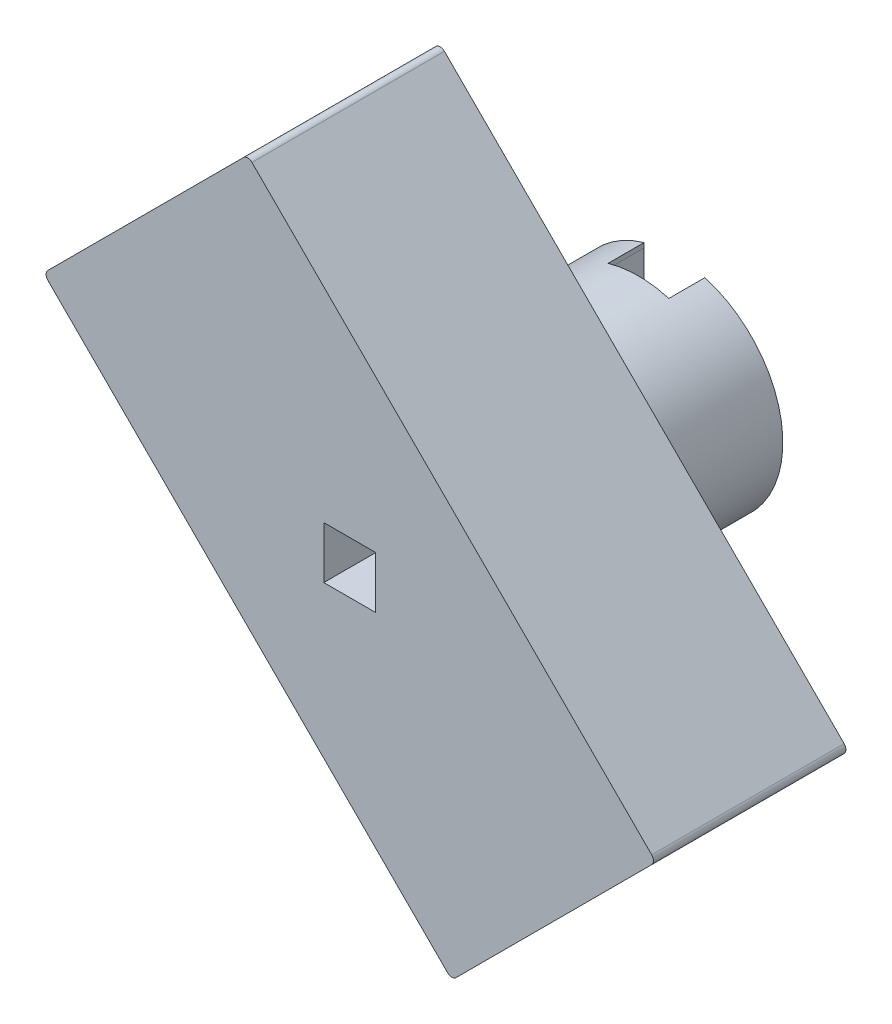
ISO-10303-21;
HEADER;
FILE_DESCRIPTION(('STEP AP214'),'2;1');
FILE_NAME('part.step','',(''),(''),'','','');
FILE_SCHEMA(('AUTOMOTIVE_DESIGN { 1 0 10303 214 1 1 1 1 }'));
ENDSEC;
DATA;
#1=APPLICATION_CONTEXT('core data for automotive mechanical design processes');
#2=APPLICATION_PROTOCOL_DEFINITION('international standard','automotive_design',2000,#1);
#3=PRODUCT_CONTEXT('',#1,'mechanical');
#4=PRODUCT('Part','Part','',(#3));
#5=PRODUCT_RELATED_PRODUCT_CATEGORY('part','',(#4));
#6=PRODUCT_DEFINITION_FORMATION('','',#4);
#7=PRODUCT_DEFINITION_CONTEXT('part definition',#1,'design');
#8=PRODUCT_DEFINITION('design','',#6,#7);
#9=PRODUCT_DEFINITION_SHAPE('','',#8);
#10=(LENGTH_UNIT() NAMED_UNIT(*) SI_UNIT(.MILLI.,.METRE.));
#11=(NAMED_UNIT(*) PLANE_ANGLE_UNIT() SI_UNIT($,.RADIAN.));
#12=(NAMED_UNIT(*) SI_UNIT($,.STERADIAN.) SOLID_ANGLE_UNIT());
#13=UNCERTAINTY_MEASURE_WITH_UNIT(LENGTH_MEASURE(1.E-05),#10,'distance_accuracy_value','');
#14=(GEOMETRIC_REPRESENTATION_CONTEXT(3) GLOBAL_UNCERTAINTY_ASSIGNED_CONTEXT((#13)) GLOBAL_UNIT_ASSIGNED_CONTEXT((#10,
#11,#12)) REPRESENTATION_CONTEXT('',''));
#15=CARTESIAN_POINT('',(0.,0.,0.));
#16=DIRECTION('',(0.,0.,1.));
#17=DIRECTION('',(1.,0.,0.));
#18=AXIS2_PLACEMENT_3D('',#15,#16,#17);
#19=CARTESIAN_POINT('',(0.,5.0927,17.7289));
#20=DIRECTION('',(0.,0.,1.));
#21=DIRECTION('',(1.,0.,0.));
#22=AXIS2_PLACEMENT_3D('',#19,#20,#21);
#23=PLANE('',#22);
#24=CARTESIAN_POINT('',(0.,5.0927,17.7289));
#25=DIRECTION('',(0.,0.,1.));
#26=DIRECTION('',(1.,0.,0.));
#27=AXIS2_PLACEMENT_3D('',#24,#25,#26);
#28=CIRCLE('',#27,7.14375);
#29=CARTESIAN_POINT('',(-2.00523079058413,11.9492453064202,17.7289));
#30=VERTEX_POINT('',#29);
#31=CARTESIAN_POINT('',(-2.00523079058413,-1.76384530642024,17.7289));
#32=VERTEX_POINT('',#31);
#33=EDGE_CURVE('E276',#30,#32,#28,.T.);
#34=ORIENTED_EDGE('',*,*,#33,.F.);
#35=CARTESIAN_POINT('',(0.,11.6205,17.7289));
#36=DIRECTION('',(0.,0.,1.));
#37=DIRECTION('',(1.,0.,0.));
#38=AXIS2_PLACEMENT_3D('',#35,#36,#37);
#39=CIRCLE('',#38,2.032);
#40=CARTESIAN_POINT('',(-2.032,11.6205,17.7289));
#41=VERTEX_POINT('',#40);
#42=EDGE_CURVE('E339',#30,#41,#39,.T.);
#43=ORIENTED_EDGE('',*,*,#42,.T.);
#44=DIRECTION('',(0.,-1.,0.));
#45=VECTOR('',#44,1.);
#46=CARTESIAN_POINT('',(-2.032,11.6205,17.7289));
#47=LINE('',#46,#45);
#48=CARTESIAN_POINT('',(-2.032,8.09704768294217,17.7289));
#49=VERTEX_POINT('',#48);
#50=EDGE_CURVE('E344',#41,#49,#47,.T.);
#51=ORIENTED_EDGE('',*,*,#50,.T.);
#52=CARTESIAN_POINT('',(0.,5.0927,17.7289));
#53=DIRECTION('',(0.,0.,1.));
#54=DIRECTION('',(1.,0.,0.));
#55=AXIS2_PLACEMENT_3D('',#52,#53,#54);
#56=CIRCLE('',#55,3.627);
#57=CARTESIAN_POINT('',(-2.032,2.08835231705783,17.7289));
#58=VERTEX_POINT('',#57);
#59=EDGE_CURVE('E313',#49,#58,#56,.T.);
#60=ORIENTED_EDGE('',*,*,#59,.T.);
#61=DIRECTION('',(0.,-1.,0.));
#62=VECTOR('',#61,1.);
#63=CARTESIAN_POINT('',(-2.032,2.08835231705783,17.7289));
#64=LINE('',#63,#62);
#65=CARTESIAN_POINT('',(-2.032,-1.4351,17.7289));
#66=VERTEX_POINT('',#65);
#67=EDGE_CURVE('E317',#58,#66,#64,.T.);
#68=ORIENTED_EDGE('',*,*,#67,.T.);
#69=CARTESIAN_POINT('',(0.,-1.4351,17.7289));
#70=DIRECTION('',(0.,0.,1.));
#71=DIRECTION('',(1.,0.,0.));
#72=AXIS2_PLACEMENT_3D('',#69,#70,#71);
#73=CIRCLE('',#72,2.032);
#74=EDGE_CURVE('E323',#66,#32,#73,.T.);
#75=ORIENTED_EDGE('',*,*,#74,.T.);
#76=EDGE_LOOP('',(#34,#43,#51,#60,#68,#75));
#77=FACE_BOUND('',#76,.T.);
#78=ADVANCED_FACE('F39',(#77),#23,.F.);
#79=CARTESIAN_POINT('',(2.00523079058413,-1.76384530642024,17.7289));
#80=VERTEX_POINT('',#79);
#81=CARTESIAN_POINT('',(2.00523079058413,11.9492453064202,17.7289));
#82=VERTEX_POINT('',#81);
#83=EDGE_CURVE('E273',#80,#82,#28,.T.);
#84=ORIENTED_EDGE('',*,*,#83,.F.);
#85=CARTESIAN_POINT('',(2.032,-1.4351,17.7289));
#86=VERTEX_POINT('',#85);
#87=EDGE_CURVE('E322',#80,#86,#73,.T.);
#88=ORIENTED_EDGE('',*,*,#87,.T.);
#89=DIRECTION('',(0.,1.,0.));
#90=VECTOR('',#89,1.);
#91=CARTESIAN_POINT('',(2.032,-1.4351,17.7289));
#92=LINE('',#91,#90);
#93=CARTESIAN_POINT('',(2.032,2.08835231705782,17.7289));
#94=VERTEX_POINT('',#93);
#95=EDGE_CURVE('E327',#86,#94,#92,.T.);
#96=ORIENTED_EDGE('',*,*,#95,.T.);
#97=CARTESIAN_POINT('',(0.,5.0927,17.7289));
#98=DIRECTION('',(0.,0.,1.));
#99=DIRECTION('',(1.,0.,0.));
#100=AXIS2_PLACEMENT_3D('',#97,#98,#99);
#101=CIRCLE('',#100,3.627);
#102=CARTESIAN_POINT('',(2.032,8.09704768294217,17.7289));
#103=VERTEX_POINT('',#102);
#104=EDGE_CURVE('E331',#94,#103,#101,.T.);
#105=ORIENTED_EDGE('',*,*,#104,.T.);
#106=DIRECTION('',(0.,1.,0.));
#107=VECTOR('',#106,1.);
#108=CARTESIAN_POINT('',(2.032,8.09704768294217,17.7289));
#109=LINE('',#108,#107);
#110=CARTESIAN_POINT('',(2.032,11.6205,17.7289));
#111=VERTEX_POINT('',#110);
#112=EDGE_CURVE('E335',#103,#111,#109,.T.);
#113=ORIENTED_EDGE('',*,*,#112,.T.);
#114=EDGE_CURVE('E340',#111,#82,#39,.T.);
#115=ORIENTED_EDGE('',*,*,#114,.T.);
#116=EDGE_LOOP('',(#84,#88,#96,#105,#113,#115));
#117=FACE_BOUND('',#116,.T.);
#118=ADVANCED_FACE('F509',(#117),#23,.F.);
#119=CARTESIAN_POINT('',(0.,11.6205,17.7289));
#120=DIRECTION('',(0.,0.,1.));
#121=DIRECTION('',(1.,0.,0.));
#122=AXIS2_PLACEMENT_3D('',#119,#120,#121);
#123=CYLINDRICAL_SURFACE('',#122,2.032);
#124=DIRECTION('',(0.,0.,-1.));
#125=VECTOR('',#124,1.);
#126=CARTESIAN_POINT('',(2.00523079058413,11.9492453064202,22.094519));
#127=LINE('',#126,#125);
#128=CARTESIAN_POINT('',(2.00523079058413,11.9492453064202,20.11015));
#129=VERTEX_POINT('',#128);
#130=EDGE_CURVE('E280',#82,#129,#127,.F.);
#131=ORIENTED_EDGE('',*,*,#130,.F.);
#132=ORIENTED_EDGE('',*,*,#114,.F.);
#133=DIRECTION('',(0.,0.,1.));
#134=VECTOR('',#133,1.);
#135=CARTESIAN_POINT('',(2.032,11.6205,17.7289));
#136=LINE('',#135,#134);
#137=CARTESIAN_POINT('',(2.032,11.6205,20.11015));
#138=VERTEX_POINT('',#137);
#139=EDGE_CURVE('E390',#111,#138,#136,.T.);
#140=ORIENTED_EDGE('',*,*,#139,.T.);
#141=CARTESIAN_POINT('',(0.,11.6205,20.11015));
#142=DIRECTION('',(0.,0.,1.));
#143=DIRECTION('',(1.,0.,0.));
#144=AXIS2_PLACEMENT_3D('',#141,#142,#143);
#145=CIRCLE('',#144,2.032);
#146=EDGE_CURVE('E374',#138,#129,#145,.T.);
#147=ORIENTED_EDGE('',*,*,#146,.T.);
#148=EDGE_LOOP('',(#131,#132,#140,#147));
#149=FACE_BOUND('',#148,.T.);
#150=ADVANCED_FACE('F515',(#149),#123,.F.);
#151=DIRECTION('',(0.,0.,-1.));
#152=VECTOR('',#151,1.);
#153=CARTESIAN_POINT('',(-2.00523079058413,11.9492453064202,22.094519));
#154=LINE('',#153,#152);
#155=CARTESIAN_POINT('',(-2.00523079058413,11.9492453064202,20.11015));
#156=VERTEX_POINT('',#155);
#157=EDGE_CURVE('E277',#156,#30,#154,.T.);
#158=ORIENTED_EDGE('',*,*,#157,.F.);
#159=CARTESIAN_POINT('',(-2.032,11.6205,20.11015));
#160=VERTEX_POINT('',#159);
#161=EDGE_CURVE('E373',#156,#160,#145,.T.);
#162=ORIENTED_EDGE('',*,*,#161,.T.);
#163=DIRECTION('',(0.,0.,1.));
#164=VECTOR('',#163,1.);
#165=CARTESIAN_POINT('',(-2.032,11.6205,17.7289));
#166=LINE('',#165,#164);
#167=EDGE_CURVE('E386',#41,#160,#166,.T.);
#168=ORIENTED_EDGE('',*,*,#167,.F.);
#169=ORIENTED_EDGE('',*,*,#42,.F.);
#170=EDGE_LOOP('',(#158,#162,#168,#169));
#171=FACE_BOUND('',#170,.T.);
#172=ADVANCED_FACE('F575',(#171),#123,.F.);
#173=CARTESIAN_POINT('',(0.,-1.4351,17.7289));
#174=DIRECTION('',(0.,0.,1.));
#175=DIRECTION('',(1.,0.,0.));
#176=AXIS2_PLACEMENT_3D('',#173,#174,#175);
#177=CYLINDRICAL_SURFACE('',#176,2.032);
#178=DIRECTION('',(0.,0.,-1.));
#179=VECTOR('',#178,1.);
#180=CARTESIAN_POINT('',(-2.00523079058413,-1.76384530642024,22.094519));
#181=LINE('',#180,#179);
#182=CARTESIAN_POINT('',(-2.00523079058413,-1.76384530642024,20.11015));
#183=VERTEX_POINT('',#182);
#184=EDGE_CURVE('E270',#32,#183,#181,.F.);
#185=ORIENTED_EDGE('',*,*,#184,.F.);
#186=ORIENTED_EDGE('',*,*,#74,.F.);
#187=DIRECTION('',(0.,0.,1.));
#188=VECTOR('',#187,1.);
#189=CARTESIAN_POINT('',(-2.032,-1.4351,17.7289));
#190=LINE('',#189,#188);
#191=CARTESIAN_POINT('',(-2.032,-1.4351,20.11015));
#192=VERTEX_POINT('',#191);
#193=EDGE_CURVE('E406',#66,#192,#190,.T.);
#194=ORIENTED_EDGE('',*,*,#193,.T.);
#195=CARTESIAN_POINT('',(0.,-1.4351,20.11015));
#196=DIRECTION('',(0.,0.,1.));
#197=DIRECTION('',(1.,0.,0.));
#198=AXIS2_PLACEMENT_3D('',#195,#196,#197);
#199=CIRCLE('',#198,2.032);
#200=EDGE_CURVE('E357',#192,#183,#199,.T.);
#201=ORIENTED_EDGE('',*,*,#200,.T.);
#202=EDGE_LOOP('',(#185,#186,#194,#201));
#203=FACE_BOUND('',#202,.T.);
#204=ADVANCED_FACE('F588',(#203),#177,.F.);
#205=DIRECTION('',(0.,0.,-1.));
#206=VECTOR('',#205,1.);
#207=CARTESIAN_POINT('',(2.00523079058413,-1.76384530642024,22.094519));
#208=LINE('',#207,#206);
#209=CARTESIAN_POINT('',(2.00523079058413,-1.76384530642024,20.11015));
#210=VERTEX_POINT('',#209);
#211=EDGE_CURVE('E254',#210,#80,#208,.T.);
#212=ORIENTED_EDGE('',*,*,#211,.F.);
#213=CARTESIAN_POINT('',(2.032,-1.4351,20.11015));
#214=VERTEX_POINT('',#213);
#215=EDGE_CURVE('E356',#210,#214,#199,.T.);
#216=ORIENTED_EDGE('',*,*,#215,.T.);
#217=DIRECTION('',(0.,0.,1.));
#218=VECTOR('',#217,1.);
#219=CARTESIAN_POINT('',(2.032,-1.4351,17.7289));
#220=LINE('',#219,#218);
#221=EDGE_CURVE('E402',#86,#214,#220,.T.);
#222=ORIENTED_EDGE('',*,*,#221,.F.);
#223=ORIENTED_EDGE('',*,*,#87,.F.);
#224=EDGE_LOOP('',(#212,#216,#222,#223));
#225=FACE_BOUND('',#224,.T.);
#226=ADVANCED_FACE('F566',(#225),#177,.F.);
#227=CARTESIAN_POINT('',(0.,5.0927,20.11015));
#228=DIRECTION('',(0.,0.,1.));
#229=DIRECTION('',(1.,0.,0.));
#230=AXIS2_PLACEMENT_3D('',#227,#228,#229);
#231=PLANE('',#230);
#232=CARTESIAN_POINT('',(0.,5.0927,20.11015));
#233=DIRECTION('',(0.,0.,-1.));
#234=DIRECTION('',(-1.,0.,0.));
#235=AXIS2_PLACEMENT_3D('',#232,#233,#234);
#236=CIRCLE('',#235,1.25);
#237=CARTESIAN_POINT('',(-1.25,5.0927,20.11015));
#238=VERTEX_POINT('',#237);
#239=EDGE_CURVE('E283',#238,#238,#236,.T.);
#240=ORIENTED_EDGE('',*,*,#239,.F.);
#241=EDGE_LOOP('',(#240));
#242=FACE_BOUND('',#241,.T.);
#243=CARTESIAN_POINT('',(0.,5.0927,20.11015));
#244=DIRECTION('',(0.,0.,1.));
#245=DIRECTION('',(1.,0.,0.));
#246=AXIS2_PLACEMENT_3D('',#243,#244,#245);
#247=CIRCLE('',#246,7.14375);
#248=EDGE_CURVE('E415',#129,#156,#247,.T.);
#249=ORIENTED_EDGE('',*,*,#248,.F.);
#250=ORIENTED_EDGE('',*,*,#146,.F.);
#251=DIRECTION('',(0.,1.,0.));
#252=VECTOR('',#251,1.);
#253=CARTESIAN_POINT('',(2.032,8.09704768294217,20.11015));
#254=LINE('',#253,#252);
#255=CARTESIAN_POINT('',(2.032,8.09704768294217,20.11015));
#256=VERTEX_POINT('',#255);
#257=EDGE_CURVE('E369',#256,#138,#254,.T.);
#258=ORIENTED_EDGE('',*,*,#257,.F.);
#259=CARTESIAN_POINT('',(0.,5.0927,20.11015));
#260=DIRECTION('',(0.,0.,1.));
#261=DIRECTION('',(1.,0.,0.));
#262=AXIS2_PLACEMENT_3D('',#259,#260,#261);
#263=CIRCLE('',#262,3.627);
#264=CARTESIAN_POINT('',(2.032,2.08835231705782,20.11015));
#265=VERTEX_POINT('',#264);
#266=EDGE_CURVE('E365',#265,#256,#263,.T.);
#267=ORIENTED_EDGE('',*,*,#266,.F.);
#268=DIRECTION('',(0.,1.,0.));
#269=VECTOR('',#268,1.);
#270=CARTESIAN_POINT('',(2.032,-1.4351,20.11015));
#271=LINE('',#270,#269);
#272=EDGE_CURVE('E361',#214,#265,#271,.T.);
#273=ORIENTED_EDGE('',*,*,#272,.F.);
#274=ORIENTED_EDGE('',*,*,#215,.F.);
#275=EDGE_CURVE('E385',#183,#210,#247,.T.);
#276=ORIENTED_EDGE('',*,*,#275,.F.);
#277=ORIENTED_EDGE('',*,*,#200,.F.);
#278=DIRECTION('',(0.,-1.,0.));
#279=VECTOR('',#278,1.);
#280=CARTESIAN_POINT('',(-2.032,2.08835231705783,20.11015));
#281=LINE('',#280,#279);
#282=CARTESIAN_POINT('',(-2.032,2.08835231705783,20.11015));
#283=VERTEX_POINT('',#282);
#284=EDGE_CURVE('E352',#283,#192,#281,.T.);
#285=ORIENTED_EDGE('',*,*,#284,.F.);
#286=CARTESIAN_POINT('',(0.,5.0927,20.11015));
#287=DIRECTION('',(0.,0.,1.));
#288=DIRECTION('',(1.,0.,0.));
#289=AXIS2_PLACEMENT_3D('',#286,#287,#288);
#290=CIRCLE('',#289,3.627);
#291=CARTESIAN_POINT('',(-2.032,8.09704768294217,20.11015));
#292=VERTEX_POINT('',#291);
#293=EDGE_CURVE('E312',#292,#283,#290,.T.);
#294=ORIENTED_EDGE('',*,*,#293,.F.);
#295=DIRECTION('',(0.,-1.,0.));
#296=VECTOR('',#295,1.);
#297=CARTESIAN_POINT('',(-2.032,11.6205,20.11015));
#298=LINE('',#297,#296);
#299=EDGE_CURVE('E318',#160,#292,#298,.T.);
#300=ORIENTED_EDGE('',*,*,#299,.F.);
#301=ORIENTED_EDGE('',*,*,#161,.F.);
#302=EDGE_LOOP('',(#249,#250,#258,#267,#273,#274,#276,#277,#285,#294,#300,#301));
#303=FACE_BOUND('',#302,.T.);
#304=ADVANCED_FACE('F562',(#242,#303),#231,.F.);
#305=CARTESIAN_POINT('',(-1.7145,3.3782,26.46015));
#306=DIRECTION('',(0.,1.,0.));
#307=DIRECTION('',(0.,0.,1.));
#308=AXIS2_PLACEMENT_3D('',#305,#306,#307);
#309=PLANE('',#308);
#310=DIRECTION('',(0.,0.,-1.));
#311=VECTOR('',#310,1.);
#312=CARTESIAN_POINT('',(1.7145,3.3782,26.46015));
#313=LINE('',#312,#311);
#314=CARTESIAN_POINT('',(1.7145,3.3782,39.16015));
#315=VERTEX_POINT('',#314);
#316=CARTESIAN_POINT('',(1.7145,3.3782,21.11015));
#317=VERTEX_POINT('',#316);
#318=EDGE_CURVE('E308',#315,#317,#313,.T.);
#319=ORIENTED_EDGE('',*,*,#318,.T.);
#320=DIRECTION('',(-1.,0.,0.));
#321=VECTOR('',#320,1.);
#322=CARTESIAN_POINT('',(1.7145,3.3782,21.11015));
#323=LINE('',#322,#321);
#324=CARTESIAN_POINT('',(-1.7145,3.3782,21.11015));
#325=VERTEX_POINT('',#324);
#326=EDGE_CURVE('E300',#317,#325,#323,.T.);
#327=ORIENTED_EDGE('',*,*,#326,.T.);
#328=DIRECTION('',(0.,0.,-1.));
#329=VECTOR('',#328,1.);
#330=CARTESIAN_POINT('',(-1.7145,3.3782,26.46015));
#331=LINE('',#330,#329);
#332=CARTESIAN_POINT('',(-1.7145,3.3782,39.16015));
#333=VERTEX_POINT('',#332);
#334=EDGE_CURVE('E216',#333,#325,#331,.T.);
#335=ORIENTED_EDGE('',*,*,#334,.F.);
#336=DIRECTION('',(1.,0.,0.));
#337=VECTOR('',#336,1.);
#338=CARTESIAN_POINT('',(-1.7145,3.3782,39.16015));
#339=LINE('',#338,#337);
#340=EDGE_CURVE('E229',#333,#315,#339,.T.);
#341=ORIENTED_EDGE('',*,*,#340,.T.);
#342=EDGE_LOOP('',(#319,#327,#335,#341));
#343=FACE_BOUND('',#342,.T.);
#344=ADVANCED_FACE('F558',(#343),#309,.T.);
#345=CARTESIAN_POINT('',(1.7145,3.3782,26.46015));
#346=DIRECTION('',(-1.,0.,0.));
#347=DIRECTION('',(0.,0.,1.));
#348=AXIS2_PLACEMENT_3D('',#345,#346,#347);
#349=PLANE('',#348);
#350=DIRECTION('',(0.,0.,-1.));
#351=VECTOR('',#350,1.);
#352=CARTESIAN_POINT('',(1.7145,6.8072,26.46015));
#353=LINE('',#352,#351);
#354=CARTESIAN_POINT('',(1.7145,6.8072,39.16015));
#355=VERTEX_POINT('',#354);
#356=CARTESIAN_POINT('',(1.7145,6.8072,21.11015));
#357=VERTEX_POINT('',#356);
#358=EDGE_CURVE('E215',#355,#357,#353,.T.);
#359=ORIENTED_EDGE('',*,*,#358,.T.);
#360=DIRECTION('',(0.,-1.,0.));
#361=VECTOR('',#360,1.);
#362=CARTESIAN_POINT('',(1.7145,6.8072,21.11015));
#363=LINE('',#362,#361);
#364=EDGE_CURVE('E296',#357,#317,#363,.T.);
#365=ORIENTED_EDGE('',*,*,#364,.T.);
#366=ORIENTED_EDGE('',*,*,#318,.F.);
#367=DIRECTION('',(0.,1.,0.));
#368=VECTOR('',#367,1.);
#369=CARTESIAN_POINT('',(1.7145,3.3782,39.16015));
#370=LINE('',#369,#368);
#371=EDGE_CURVE('E233',#315,#355,#370,.T.);
#372=ORIENTED_EDGE('',*,*,#371,.T.);
#373=EDGE_LOOP('',(#359,#365,#366,#372));
#374=FACE_BOUND('',#373,.T.);
#375=ADVANCED_FACE('F555',(#374),#349,.T.);
#376=CARTESIAN_POINT('',(1.7145,6.8072,26.46015));
#377=DIRECTION('',(0.,-1.,0.));
#378=DIRECTION('',(0.,0.,-1.));
#379=AXIS2_PLACEMENT_3D('',#376,#377,#378);
#380=PLANE('',#379);
#381=DIRECTION('',(0.,0.,-1.));
#382=VECTOR('',#381,1.);
#383=CARTESIAN_POINT('',(-1.7145,6.8072,26.46015));
#384=LINE('',#383,#382);
#385=CARTESIAN_POINT('',(-1.7145,6.8072,39.16015));
#386=VERTEX_POINT('',#385);
#387=CARTESIAN_POINT('',(-1.7145,6.8072,21.11015));
#388=VERTEX_POINT('',#387);
#389=EDGE_CURVE('E204',#386,#388,#384,.T.);
#390=ORIENTED_EDGE('',*,*,#389,.T.);
#391=DIRECTION('',(1.,0.,0.));
#392=VECTOR('',#391,1.);
#393=CARTESIAN_POINT('',(-1.7145,6.8072,21.11015));
#394=LINE('',#393,#392);
#395=EDGE_CURVE('E293',#388,#357,#394,.T.);
#396=ORIENTED_EDGE('',*,*,#395,.T.);
#397=ORIENTED_EDGE('',*,*,#358,.F.);
#398=DIRECTION('',(-1.,0.,0.));
#399=VECTOR('',#398,1.);
#400=CARTESIAN_POINT('',(1.7145,6.8072,39.16015));
#401=LINE('',#400,#399);
#402=EDGE_CURVE('E219',#355,#386,#401,.T.);
#403=ORIENTED_EDGE('',*,*,#402,.T.);
#404=EDGE_LOOP('',(#390,#396,#397,#403));
#405=FACE_BOUND('',#404,.T.);
#406=ADVANCED_FACE('F220',(#405),#380,.T.);
#407=CARTESIAN_POINT('',(-1.7145,6.8072,26.46015));
#408=DIRECTION('',(1.,0.,0.));
#409=DIRECTION('',(0.,0.,-1.));
#410=AXIS2_PLACEMENT_3D('',#407,#408,#409);
#411=PLANE('',#410);
#412=ORIENTED_EDGE('',*,*,#334,.T.);
#413=DIRECTION('',(0.,1.,0.));
#414=VECTOR('',#413,1.);
#415=CARTESIAN_POINT('',(-1.7145,3.3782,21.11015));
#416=LINE('',#415,#414);
#417=EDGE_CURVE('E211',#325,#388,#416,.T.);
#418=ORIENTED_EDGE('',*,*,#417,.T.);
#419=ORIENTED_EDGE('',*,*,#389,.F.);
#420=DIRECTION('',(0.,-1.,0.));
#421=VECTOR('',#420,1.);
#422=CARTESIAN_POINT('',(-1.7145,6.8072,39.16015));
#423=LINE('',#422,#421);
#424=EDGE_CURVE('E209',#386,#333,#423,.T.);
#425=ORIENTED_EDGE('',*,*,#424,.T.);
#426=EDGE_LOOP('',(#412,#418,#419,#425));
#427=FACE_BOUND('',#426,.T.);
#428=ADVANCED_FACE('F207',(#427),#411,.T.);
#429=CARTESIAN_POINT('',(0.,5.0927,17.7289));
#430=DIRECTION('',(0.,0.,1.));
#431=DIRECTION('',(1.,0.,0.));
#432=AXIS2_PLACEMENT_3D('',#429,#430,#431);
#433=CYLINDRICAL_SURFACE('',#432,3.627);
#434=ORIENTED_EDGE('',*,*,#293,.T.);
#435=DIRECTION('',(0.,0.,1.));
#436=VECTOR('',#435,1.);
#437=CARTESIAN_POINT('',(-2.032,2.08835231705783,17.7289));
#438=LINE('',#437,#436);
#439=EDGE_CURVE('E348',#58,#283,#438,.T.);
#440=ORIENTED_EDGE('',*,*,#439,.F.);
#441=ORIENTED_EDGE('',*,*,#59,.F.);
#442=DIRECTION('',(0.,0.,1.));
#443=VECTOR('',#442,1.);
#444=CARTESIAN_POINT('',(-2.032,8.09704768294217,17.7289));
#445=LINE('',#444,#443);
#446=EDGE_CURVE('E381',#49,#292,#445,.T.);
#447=ORIENTED_EDGE('',*,*,#446,.T.);
#448=EDGE_LOOP('',(#434,#440,#441,#447));
#449=FACE_BOUND('',#448,.T.);
#450=ADVANCED_FACE('F520',(#449),#433,.F.);
#451=CARTESIAN_POINT('',(-2.032,11.6205,17.7289));
#452=DIRECTION('',(-1.,0.,0.));
#453=DIRECTION('',(0.,0.,1.));
#454=AXIS2_PLACEMENT_3D('',#451,#452,#453);
#455=PLANE('',#454);
#456=ORIENTED_EDGE('',*,*,#299,.T.);
#457=ORIENTED_EDGE('',*,*,#446,.F.);
#458=ORIENTED_EDGE('',*,*,#50,.F.);
#459=ORIENTED_EDGE('',*,*,#167,.T.);
#460=EDGE_LOOP('',(#456,#457,#458,#459));
#461=FACE_BOUND('',#460,.T.);
#462=ADVANCED_FACE('F568',(#461),#455,.F.);
#463=CARTESIAN_POINT('',(2.032,8.09704768294217,17.7289));
#464=DIRECTION('',(1.,0.,0.));
#465=DIRECTION('',(0.,1.,0.));
#466=AXIS2_PLACEMENT_3D('',#463,#464,#465);
#467=PLANE('',#466);
#468=ORIENTED_EDGE('',*,*,#257,.T.);
#469=ORIENTED_EDGE('',*,*,#139,.F.);
#470=ORIENTED_EDGE('',*,*,#112,.F.);
#471=DIRECTION('',(0.,0.,1.));
#472=VECTOR('',#471,1.);
#473=CARTESIAN_POINT('',(2.032,8.09704768294217,17.7289));
#474=LINE('',#473,#472);
#475=EDGE_CURVE('E394',#103,#256,#474,.T.);
#476=ORIENTED_EDGE('',*,*,#475,.T.);
#477=EDGE_LOOP('',(#468,#469,#470,#476));
#478=FACE_BOUND('',#477,.T.);
#479=ADVANCED_FACE('F571',(#478),#467,.F.);
#480=CARTESIAN_POINT('',(0.,5.0927,17.7289));
#481=DIRECTION('',(0.,0.,1.));
#482=DIRECTION('',(1.,0.,0.));
#483=AXIS2_PLACEMENT_3D('',#480,#481,#482);
#484=CYLINDRICAL_SURFACE('',#483,3.627);
#485=ORIENTED_EDGE('',*,*,#266,.T.);
#486=ORIENTED_EDGE('',*,*,#475,.F.);
#487=ORIENTED_EDGE('',*,*,#104,.F.);
#488=DIRECTION('',(0.,0.,1.));
#489=VECTOR('',#488,1.);
#490=CARTESIAN_POINT('',(2.032,2.08835231705782,17.7289));
#491=LINE('',#490,#489);
#492=EDGE_CURVE('E398',#94,#265,#491,.T.);
#493=ORIENTED_EDGE('',*,*,#492,.T.);
#494=EDGE_LOOP('',(#485,#486,#487,#493));
#495=FACE_BOUND('',#494,.T.);
#496=ADVANCED_FACE('F579',(#495),#484,.F.);
#497=CARTESIAN_POINT('',(2.032,-1.4351,17.7289));
#498=DIRECTION('',(1.,0.,0.));
#499=DIRECTION('',(0.,1.,0.));
#500=AXIS2_PLACEMENT_3D('',#497,#498,#499);
#501=PLANE('',#500);
#502=ORIENTED_EDGE('',*,*,#272,.T.);
#503=ORIENTED_EDGE('',*,*,#492,.F.);
#504=ORIENTED_EDGE('',*,*,#95,.F.);
#505=ORIENTED_EDGE('',*,*,#221,.T.);
#506=EDGE_LOOP('',(#502,#503,#504,#505));
#507=FACE_BOUND('',#506,.T.);
#508=ADVANCED_FACE('F583',(#507),#501,.F.);
#509=CARTESIAN_POINT('',(-2.032,2.08835231705783,17.7289));
#510=DIRECTION('',(-1.,0.,0.));
#511=DIRECTION('',(0.,-1.,0.));
#512=AXIS2_PLACEMENT_3D('',#509,#510,#511);
#513=PLANE('',#512);
#514=ORIENTED_EDGE('',*,*,#284,.T.);
#515=ORIENTED_EDGE('',*,*,#193,.F.);
#516=ORIENTED_EDGE('',*,*,#67,.F.);
#517=ORIENTED_EDGE('',*,*,#439,.T.);
#518=EDGE_LOOP('',(#514,#515,#516,#517));
#519=FACE_BOUND('',#518,.T.);
#520=ADVANCED_FACE('F549',(#519),#513,.F.);
#521=CARTESIAN_POINT('',(0.,0.,21.11015));
#522=DIRECTION('',(0.,0.,-1.));
#523=DIRECTION('',(-1.,0.,0.));
#524=AXIS2_PLACEMENT_3D('',#521,#522,#523);
#525=PLANE('',#524);
#526=CARTESIAN_POINT('',(0.,5.0927,21.11015));
#527=DIRECTION('',(0.,0.,-1.));
#528=DIRECTION('',(-1.,0.,0.));
#529=AXIS2_PLACEMENT_3D('',#526,#527,#528);
#530=CIRCLE('',#529,1.25);
#531=CARTESIAN_POINT('',(-1.25,5.0927,21.11015));
#532=VERTEX_POINT('',#531);
#533=EDGE_CURVE('E284',#532,#532,#530,.T.);
#534=ORIENTED_EDGE('',*,*,#533,.T.);
#535=EDGE_LOOP('',(#534));
#536=FACE_BOUND('',#535,.T.);
#537=ORIENTED_EDGE('',*,*,#417,.F.);
#538=ORIENTED_EDGE('',*,*,#326,.F.);
#539=ORIENTED_EDGE('',*,*,#364,.F.);
#540=ORIENTED_EDGE('',*,*,#395,.F.);
#541=EDGE_LOOP('',(#537,#538,#539,#540));
#542=FACE_BOUND('',#541,.T.);
#543=ADVANCED_FACE('F545',(#536,#542),#525,.F.);
#544=CARTESIAN_POINT('',(0.,5.0927,21.11015));
#545=DIRECTION('',(0.,0.,-1.));
#546=DIRECTION('',(-1.,0.,0.));
#547=AXIS2_PLACEMENT_3D('',#544,#545,#546);
#548=CYLINDRICAL_SURFACE('',#547,1.25);
#549=ORIENTED_EDGE('',*,*,#533,.F.);
#550=EDGE_LOOP('',(#549));
#551=FACE_BOUND('',#550,.T.);
#552=ORIENTED_EDGE('',*,*,#239,.T.);
#553=EDGE_LOOP('',(#552));
#554=FACE_BOUND('',#553,.T.);
#555=ADVANCED_FACE('F541',(#551,#554),#548,.F.);
#556=CARTESIAN_POINT('',(0.,5.0927,26.46015));
#557=DIRECTION('',(0.,0.,-1.));
#558=DIRECTION('',(-1.,0.,0.));
#559=AXIS2_PLACEMENT_3D('',#556,#557,#558);
#560=CYLINDRICAL_SURFACE('',#559,7.14375);
#561=CARTESIAN_POINT('',(0.,5.0927,26.06015));
#562=DIRECTION('',(0.,0.,1.));
#563=DIRECTION('',(1.,0.,0.));
#564=AXIS2_PLACEMENT_3D('',#561,#562,#563);
#565=CIRCLE('',#564,7.14375);
#566=CARTESIAN_POINT('',(7.14375,5.0927,26.06015));
#567=VERTEX_POINT('',#566);
#568=EDGE_CURVE('E11',#567,#567,#565,.F.);
#569=ORIENTED_EDGE('',*,*,#568,.T.);
#570=EDGE_LOOP('',(#569));
#571=FACE_BOUND('',#570,.T.);
#572=ORIENTED_EDGE('',*,*,#248,.T.);
#573=ORIENTED_EDGE('',*,*,#157,.T.);
#574=ORIENTED_EDGE('',*,*,#33,.T.);
#575=ORIENTED_EDGE('',*,*,#184,.T.);
#576=ORIENTED_EDGE('',*,*,#275,.T.);
#577=ORIENTED_EDGE('',*,*,#211,.T.);
#578=ORIENTED_EDGE('',*,*,#83,.T.);
#579=ORIENTED_EDGE('',*,*,#130,.T.);
#580=EDGE_LOOP('',(#572,#573,#574,#575,#576,#577,#578,#579));
#581=FACE_BOUND('',#580,.T.);
#582=ADVANCED_FACE('F538',(#571,#581),#560,.T.);
#583=CARTESIAN_POINT('',(0.,0.,39.16015));
#584=DIRECTION('',(0.,0.,1.));
#585=DIRECTION('',(1.,0.,0.));
#586=AXIS2_PLACEMENT_3D('',#583,#584,#585);
#587=PLANE('',#586);
#588=DIRECTION('',(-0.707106781186547,-0.707106781186547,0.));
#589=VECTOR('',#588,1.);
#590=CARTESIAN_POINT('',(-20.2055762724056,11.8278920908019,39.16015));
#591=LINE('',#590,#589);
#592=CARTESIAN_POINT('',(-7.01803480327649,25.015433559931,39.16015));
#593=VERTEX_POINT('',#592);
#594=CARTESIAN_POINT('',(-19.922733559931,12.1107348032765,39.16015));
#595=VERTEX_POINT('',#594);
#596=EDGE_CURVE('E250',#593,#595,#591,.T.);
#597=ORIENTED_EDGE('',*,*,#596,.T.);
#598=CARTESIAN_POINT('',(-19.6398908474564,11.8278920908019,39.16015));
#599=DIRECTION('',(0.,0.,1.));
#600=DIRECTION('',(1.,0.,0.));
#601=AXIS2_PLACEMENT_3D('',#598,#599,#600);
#602=CIRCLE('',#601,0.4);
#603=CARTESIAN_POINT('',(-19.922733559931,11.5450493783272,39.16015));
#604=VERTEX_POINT('',#603);
#605=EDGE_CURVE('E454',#595,#604,#602,.T.);
#606=ORIENTED_EDGE('',*,*,#605,.T.);
#607=DIRECTION('',(0.707106781186547,-0.707106781186547,0.));
#608=VECTOR('',#607,1.);
#609=CARTESIAN_POINT('',(-20.2055762724056,11.8278920908019,39.16015));
#610=LINE('',#609,#608);
#611=CARTESIAN_POINT('',(6.45234937832724,-14.830033559931,39.16015));
#612=VERTEX_POINT('',#611);
#613=EDGE_CURVE('E239',#604,#612,#610,.T.);
#614=ORIENTED_EDGE('',*,*,#613,.T.);
#615=CARTESIAN_POINT('',(6.73519209080187,-14.5471908474564,39.16015));
#616=DIRECTION('',(0.,0.,1.));
#617=DIRECTION('',(1.,0.,0.));
#618=AXIS2_PLACEMENT_3D('',#615,#616,#617);
#619=CIRCLE('',#618,0.4);
#620=CARTESIAN_POINT('',(7.01803480327649,-14.830033559931,39.16015));
#621=VERTEX_POINT('',#620);
#622=EDGE_CURVE('E448',#612,#621,#619,.T.);
#623=ORIENTED_EDGE('',*,*,#622,.T.);
#624=DIRECTION('',(0.707106781186547,0.707106781186547,0.));
#625=VECTOR('',#624,1.);
#626=CARTESIAN_POINT('',(6.73519209080187,-15.1128762724056,39.16015));
#627=LINE('',#626,#625);
#628=CARTESIAN_POINT('',(19.922733559931,-1.92533480327649,39.16015));
#629=VERTEX_POINT('',#628);
#630=EDGE_CURVE('E243',#621,#629,#627,.T.);
#631=ORIENTED_EDGE('',*,*,#630,.T.);
#632=CARTESIAN_POINT('',(19.6398908474564,-1.64249209080186,39.16015));
#633=DIRECTION('',(0.,0.,1.));
#634=DIRECTION('',(1.,0.,0.));
#635=AXIS2_PLACEMENT_3D('',#632,#633,#634);
#636=CIRCLE('',#635,0.4);
#637=CARTESIAN_POINT('',(19.922733559931,-1.35964937832724,39.16015));
#638=VERTEX_POINT('',#637);
#639=EDGE_CURVE('E62',#629,#638,#636,.T.);
#640=ORIENTED_EDGE('',*,*,#639,.T.);
#641=DIRECTION('',(-0.707106781186547,0.707106781186547,0.));
#642=VECTOR('',#641,1.);
#643=CARTESIAN_POINT('',(-6.73519209080186,25.2982762724056,39.16015));
#644=LINE('',#643,#642);
#645=CARTESIAN_POINT('',(-6.45234937832724,25.015433559931,39.16015));
#646=VERTEX_POINT('',#645);
#647=EDGE_CURVE('E247',#638,#646,#644,.T.);
#648=ORIENTED_EDGE('',*,*,#647,.T.);
#649=CARTESIAN_POINT('',(-6.73519209080187,24.7325908474564,39.16015));
#650=DIRECTION('',(0.,0.,1.));
#651=DIRECTION('',(1.,0.,0.));
#652=AXIS2_PLACEMENT_3D('',#649,#650,#651);
#653=CIRCLE('',#652,0.4);
#654=EDGE_CURVE('E451',#646,#593,#653,.T.);
#655=ORIENTED_EDGE('',*,*,#654,.T.);
#656=EDGE_LOOP('',(#597,#606,#614,#623,#631,#640,#648,#655));
#657=FACE_BOUND('',#656,.T.);
#658=ORIENTED_EDGE('',*,*,#424,.F.);
#659=ORIENTED_EDGE('',*,*,#402,.F.);
#660=ORIENTED_EDGE('',*,*,#371,.F.);
#661=ORIENTED_EDGE('',*,*,#340,.F.);
#662=EDGE_LOOP('',(#658,#659,#660,#661));
#663=FACE_BOUND('',#662,.T.);
#664=ADVANCED_FACE('F227',(#657,#663),#587,.T.);
#665=CARTESIAN_POINT('',(0.,0.,26.46015));
#666=DIRECTION('',(0.,0.,1.));
#667=DIRECTION('',(1.,0.,0.));
#668=AXIS2_PLACEMENT_3D('',#665,#666,#667);
#669=PLANE('',#668);
#670=CARTESIAN_POINT('',(0.,5.0927,26.46015));
#671=DIRECTION('',(0.,0.,1.));
#672=DIRECTION('',(1.,0.,0.));
#673=AXIS2_PLACEMENT_3D('',#670,#671,#672);
#674=CIRCLE('',#673,7.54375);
#675=CARTESIAN_POINT('',(7.54375,5.0927,26.46015));
#676=VERTEX_POINT('',#675);
#677=EDGE_CURVE('E423',#676,#676,#674,.T.);
#678=ORIENTED_EDGE('',*,*,#677,.T.);
#679=EDGE_LOOP('',(#678));
#680=FACE_BOUND('',#679,.T.);
#681=DIRECTION('',(0.707106781186547,-0.707106781186547,0.));
#682=VECTOR('',#681,1.);
#683=CARTESIAN_POINT('',(-20.2055762724056,11.8278920908019,26.46015));
#684=LINE('',#683,#682);
#685=CARTESIAN_POINT('',(-19.922733559931,11.5450493783272,26.46015));
#686=VERTEX_POINT('',#685);
#687=CARTESIAN_POINT('',(6.45234937832724,-14.830033559931,26.46015));
#688=VERTEX_POINT('',#687);
#689=EDGE_CURVE('E238',#686,#688,#684,.T.);
#690=ORIENTED_EDGE('',*,*,#689,.F.);
#691=CARTESIAN_POINT('',(-19.6398908474564,11.8278920908019,26.46015));
#692=DIRECTION('',(0.,0.,1.));
#693=DIRECTION('',(1.,0.,0.));
#694=AXIS2_PLACEMENT_3D('',#691,#692,#693);
#695=CIRCLE('',#694,0.4);
#696=CARTESIAN_POINT('',(-19.922733559931,12.1107348032765,26.46015));
#697=VERTEX_POINT('',#696);
#698=EDGE_CURVE('E436',#686,#697,#695,.F.);
#699=ORIENTED_EDGE('',*,*,#698,.T.);
#700=DIRECTION('',(-0.707106781186547,-0.707106781186547,0.));
#701=VECTOR('',#700,1.);
#702=CARTESIAN_POINT('',(-20.2055762724056,11.8278920908019,26.46015));
#703=LINE('',#702,#701);
#704=CARTESIAN_POINT('',(-7.01803480327649,25.015433559931,26.46015));
#705=VERTEX_POINT('',#704);
#706=EDGE_CURVE('E244',#705,#697,#703,.T.);
#707=ORIENTED_EDGE('',*,*,#706,.F.);
#708=CARTESIAN_POINT('',(-6.73519209080187,24.7325908474564,26.46015));
#709=DIRECTION('',(0.,0.,1.));
#710=DIRECTION('',(1.,0.,0.));
#711=AXIS2_PLACEMENT_3D('',#708,#709,#710);
#712=CIRCLE('',#711,0.4);
#713=CARTESIAN_POINT('',(-6.45234937832724,25.015433559931,26.46015));
#714=VERTEX_POINT('',#713);
#715=EDGE_CURVE('E433',#705,#714,#712,.F.);
#716=ORIENTED_EDGE('',*,*,#715,.T.);
#717=DIRECTION('',(-0.707106781186547,0.707106781186547,0.));
#718=VECTOR('',#717,1.);
#719=CARTESIAN_POINT('',(-6.73519209080186,25.2982762724056,26.46015));
#720=LINE('',#719,#718);
#721=CARTESIAN_POINT('',(19.922733559931,-1.35964937832724,26.46015));
#722=VERTEX_POINT('',#721);
#723=EDGE_CURVE('E262',#722,#714,#720,.T.);
#724=ORIENTED_EDGE('',*,*,#723,.F.);
#725=CARTESIAN_POINT('',(19.6398908474564,-1.64249209080186,26.46015));
#726=DIRECTION('',(0.,0.,1.));
#727=DIRECTION('',(1.,0.,0.));
#728=AXIS2_PLACEMENT_3D('',#725,#726,#727);
#729=CIRCLE('',#728,0.4);
#730=CARTESIAN_POINT('',(19.922733559931,-1.92533480327649,26.46015));
#731=VERTEX_POINT('',#730);
#732=EDGE_CURVE('E427',#722,#731,#729,.F.);
#733=ORIENTED_EDGE('',*,*,#732,.T.);
#734=DIRECTION('',(0.707106781186547,0.707106781186547,0.));
#735=VECTOR('',#734,1.);
#736=CARTESIAN_POINT('',(6.73519209080187,-15.1128762724056,26.46015));
#737=LINE('',#736,#735);
#738=CARTESIAN_POINT('',(7.01803480327649,-14.830033559931,26.46015));
#739=VERTEX_POINT('',#738);
#740=EDGE_CURVE('E258',#739,#731,#737,.T.);
#741=ORIENTED_EDGE('',*,*,#740,.F.);
#742=CARTESIAN_POINT('',(6.73519209080187,-14.5471908474564,26.46015));
#743=DIRECTION('',(0.,0.,1.));
#744=DIRECTION('',(1.,0.,0.));
#745=AXIS2_PLACEMENT_3D('',#742,#743,#744);
#746=CIRCLE('',#745,0.4);
#747=EDGE_CURVE('E430',#739,#688,#746,.F.);
#748=ORIENTED_EDGE('',*,*,#747,.T.);
#749=EDGE_LOOP('',(#690,#699,#707,#716,#724,#733,#741,#748));
#750=FACE_BOUND('',#749,.T.);
#751=ADVANCED_FACE('F477',(#680,#750),#669,.F.);
#752=CARTESIAN_POINT('',(-20.2055762724056,11.8278920908019,39.16015));
#753=DIRECTION('',(0.707106781186548,0.707106781186548,0.));
#754=DIRECTION('',(-0.707106781186548,0.707106781186548,0.));
#755=AXIS2_PLACEMENT_3D('',#752,#753,#754);
#756=PLANE('',#755);
#757=ORIENTED_EDGE('',*,*,#613,.F.);
#758=DIRECTION('',(0.,0.,-1.));
#759=VECTOR('',#758,1.);
#760=CARTESIAN_POINT('',(-19.922733559931,11.5450493783272,39.16015));
#761=LINE('',#760,#759);
#762=EDGE_CURVE('E419',#604,#686,#761,.T.);
#763=ORIENTED_EDGE('',*,*,#762,.T.);
#764=ORIENTED_EDGE('',*,*,#689,.T.);
#765=DIRECTION('',(0.,0.,-1.));
#766=VECTOR('',#765,1.);
#767=CARTESIAN_POINT('',(6.45234937832725,-14.830033559931,39.16015));
#768=LINE('',#767,#766);
#769=EDGE_CURVE('E416',#688,#612,#768,.F.);
#770=ORIENTED_EDGE('',*,*,#769,.T.);
#771=EDGE_LOOP('',(#757,#763,#764,#770));
#772=FACE_BOUND('',#771,.T.);
#773=ADVANCED_FACE('F498',(#772),#756,.F.);
#774=CARTESIAN_POINT('',(6.73519209080187,-15.1128762724056,39.16015));
#775=DIRECTION('',(-0.707106781186548,0.707106781186548,0.));
#776=DIRECTION('',(-0.707106781186548,-0.707106781186548,0.));
#777=AXIS2_PLACEMENT_3D('',#774,#775,#776);
#778=PLANE('',#777);
#779=ORIENTED_EDGE('',*,*,#630,.F.);
#780=DIRECTION('',(0.,0.,-1.));
#781=VECTOR('',#780,1.);
#782=CARTESIAN_POINT('',(7.01803480327649,-14.830033559931,39.16015));
#783=LINE('',#782,#781);
#784=EDGE_CURVE('E48',#621,#739,#783,.T.);
#785=ORIENTED_EDGE('',*,*,#784,.T.);
#786=ORIENTED_EDGE('',*,*,#740,.T.);
#787=DIRECTION('',(0.,0.,-1.));
#788=VECTOR('',#787,1.);
#789=CARTESIAN_POINT('',(19.922733559931,-1.92533480327649,39.16015));
#790=LINE('',#789,#788);
#791=EDGE_CURVE('E463',#731,#629,#790,.F.);
#792=ORIENTED_EDGE('',*,*,#791,.T.);
#793=EDGE_LOOP('',(#779,#785,#786,#792));
#794=FACE_BOUND('',#793,.T.);
#795=ADVANCED_FACE('F471',(#794),#778,.F.);
#796=CARTESIAN_POINT('',(-6.73519209080186,25.2982762724056,39.16015));
#797=DIRECTION('',(-0.707106781186548,-0.707106781186548,0.));
#798=DIRECTION('',(0.707106781186548,-0.707106781186548,0.));
#799=AXIS2_PLACEMENT_3D('',#796,#797,#798);
#800=PLANE('',#799);
#801=ORIENTED_EDGE('',*,*,#723,.T.);
#802=DIRECTION('',(0.,0.,-1.));
#803=VECTOR('',#802,1.);
#804=CARTESIAN_POINT('',(-6.45234937832724,25.015433559931,39.16015));
#805=LINE('',#804,#803);
#806=EDGE_CURVE('E55',#714,#646,#805,.F.);
#807=ORIENTED_EDGE('',*,*,#806,.T.);
#808=ORIENTED_EDGE('',*,*,#647,.F.);
#809=DIRECTION('',(0.,0.,-1.));
#810=VECTOR('',#809,1.);
#811=CARTESIAN_POINT('',(19.922733559931,-1.35964937832725,39.16015));
#812=LINE('',#811,#810);
#813=EDGE_CURVE('E457',#638,#722,#812,.T.);
#814=ORIENTED_EDGE('',*,*,#813,.T.);
#815=EDGE_LOOP('',(#801,#807,#808,#814));
#816=FACE_BOUND('',#815,.T.);
#817=ADVANCED_FACE('F482',(#816),#800,.F.);
#818=CARTESIAN_POINT('',(-20.2055762724056,11.8278920908019,39.16015));
#819=DIRECTION('',(0.707106781186548,-0.707106781186548,0.));
#820=DIRECTION('',(0.707106781186548,0.707106781186548,0.));
#821=AXIS2_PLACEMENT_3D('',#818,#819,#820);
#822=PLANE('',#821);
#823=ORIENTED_EDGE('',*,*,#706,.T.);
#824=DIRECTION('',(0.,0.,-1.));
#825=VECTOR('',#824,1.);
#826=CARTESIAN_POINT('',(-19.922733559931,12.1107348032765,39.16015));
#827=LINE('',#826,#825);
#828=EDGE_CURVE('E443',#697,#595,#827,.F.);
#829=ORIENTED_EDGE('',*,*,#828,.T.);
#830=ORIENTED_EDGE('',*,*,#596,.F.);
#831=DIRECTION('',(0.,0.,-1.));
#832=VECTOR('',#831,1.);
#833=CARTESIAN_POINT('',(-7.01803480327648,25.015433559931,39.16015));
#834=LINE('',#833,#832);
#835=EDGE_CURVE('E439',#593,#705,#834,.T.);
#836=ORIENTED_EDGE('',*,*,#835,.T.);
#837=EDGE_LOOP('',(#823,#829,#830,#836));
#838=FACE_BOUND('',#837,.T.);
#839=ADVANCED_FACE('F490',(#838),#822,.F.);
#840=CARTESIAN_POINT('',(-19.6398908474564,11.8278920908019,39.16015));
#841=DIRECTION('',(0.,0.,-1.));
#842=DIRECTION('',(-1.,0.,0.));
#843=AXIS2_PLACEMENT_3D('',#840,#841,#842);
#844=CYLINDRICAL_SURFACE('',#843,0.4);
#845=ORIENTED_EDGE('',*,*,#605,.F.);
#846=ORIENTED_EDGE('',*,*,#828,.F.);
#847=ORIENTED_EDGE('',*,*,#698,.F.);
#848=ORIENTED_EDGE('',*,*,#762,.F.);
#849=EDGE_LOOP('',(#845,#846,#847,#848));
#850=FACE_BOUND('',#849,.T.);
#851=ADVANCED_FACE('F495',(#850),#844,.T.);
#852=CARTESIAN_POINT('',(-6.73519209080187,24.7325908474564,39.16015));
#853=DIRECTION('',(0.,0.,-1.));
#854=DIRECTION('',(-1.,0.,0.));
#855=AXIS2_PLACEMENT_3D('',#852,#853,#854);
#856=CYLINDRICAL_SURFACE('',#855,0.4);
#857=ORIENTED_EDGE('',*,*,#654,.F.);
#858=ORIENTED_EDGE('',*,*,#806,.F.);
#859=ORIENTED_EDGE('',*,*,#715,.F.);
#860=ORIENTED_EDGE('',*,*,#835,.F.);
#861=EDGE_LOOP('',(#857,#858,#859,#860));
#862=FACE_BOUND('',#861,.T.);
#863=ADVANCED_FACE('F487',(#862),#856,.T.);
#864=CARTESIAN_POINT('',(6.73519209080187,-14.5471908474564,39.16015));
#865=DIRECTION('',(0.,0.,-1.));
#866=DIRECTION('',(-1.,0.,0.));
#867=AXIS2_PLACEMENT_3D('',#864,#865,#866);
#868=CYLINDRICAL_SURFACE('',#867,0.4);
#869=ORIENTED_EDGE('',*,*,#622,.F.);
#870=ORIENTED_EDGE('',*,*,#769,.F.);
#871=ORIENTED_EDGE('',*,*,#747,.F.);
#872=ORIENTED_EDGE('',*,*,#784,.F.);
#873=EDGE_LOOP('',(#869,#870,#871,#872));
#874=FACE_BOUND('',#873,.T.);
#875=ADVANCED_FACE('F500',(#874),#868,.T.);
#876=CARTESIAN_POINT('',(19.6398908474564,-1.64249209080186,39.16015));
#877=DIRECTION('',(0.,0.,-1.));
#878=DIRECTION('',(-1.,0.,0.));
#879=AXIS2_PLACEMENT_3D('',#876,#877,#878);
#880=CYLINDRICAL_SURFACE('',#879,0.4);
#881=ORIENTED_EDGE('',*,*,#639,.F.);
#882=ORIENTED_EDGE('',*,*,#791,.F.);
#883=ORIENTED_EDGE('',*,*,#732,.F.);
#884=ORIENTED_EDGE('',*,*,#813,.F.);
#885=EDGE_LOOP('',(#881,#882,#883,#884));
#886=FACE_BOUND('',#885,.T.);
#887=ADVANCED_FACE('F481',(#886),#880,.T.);
#888=CARTESIAN_POINT('',(0.,5.0927,26.06015));
#889=DIRECTION('',(0.,0.,1.));
#890=DIRECTION('',(1.,0.,0.));
#891=AXIS2_PLACEMENT_3D('',#888,#889,#890);
#892=TOROIDAL_SURFACE('',#891,7.54375,0.4);
#893=ORIENTED_EDGE('',*,*,#677,.F.);
#894=EDGE_LOOP('',(#893));
#895=FACE_BOUND('',#894,.T.);
#896=ORIENTED_EDGE('',*,*,#568,.F.);
#897=EDGE_LOOP('',(#896));
#898=FACE_BOUND('',#897,.T.);
#899=ADVANCED_FACE('F41',(#895,#898),#892,.F.);
#900=CLOSED_SHELL('',(#78,#118,#150,#172,#204,#226,#304,#344,#375,#406,#428,#450,#462,#479,#496,
#508,#520,#543,#555,#582,#664,#751,#773,#795,#817,#839,#851,#863,#875,#887,#899));
#901=MANIFOLD_SOLID_BREP('B2',#900);
#902=ADVANCED_BREP_SHAPE_REPRESENTATION('',(#18,#901),#14);
#903=SHAPE_DEFINITION_REPRESENTATION(#9,#902);
ENDSEC;
END-ISO-10303-21;
